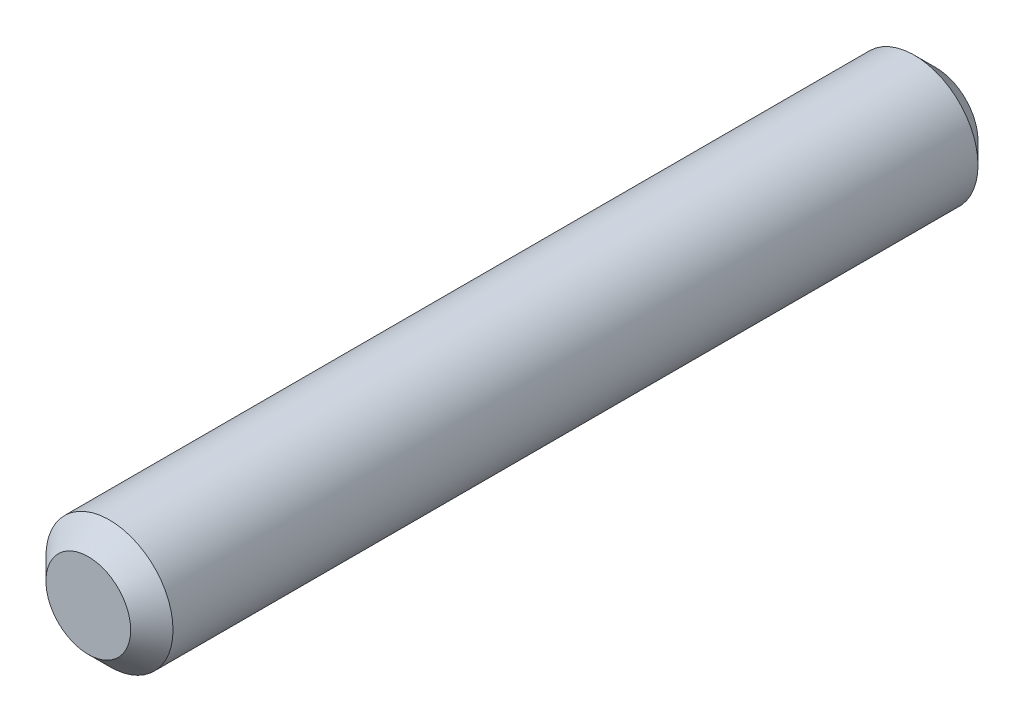
ISO-10303-21;
HEADER;
FILE_DESCRIPTION(('STEP AP214'),'2;1');
FILE_NAME('part.step','',(''),(''),'','','');
FILE_SCHEMA(('AUTOMOTIVE_DESIGN { 1 0 10303 214 1 1 1 1 }'));
ENDSEC;
DATA;
#1=APPLICATION_CONTEXT('core data for automotive mechanical design processes');
#2=APPLICATION_PROTOCOL_DEFINITION('international standard','automotive_design',2000,#1);
#3=PRODUCT_CONTEXT('',#1,'mechanical');
#4=PRODUCT('Part','Part','',(#3));
#5=PRODUCT_RELATED_PRODUCT_CATEGORY('part','',(#4));
#6=PRODUCT_DEFINITION_FORMATION('','',#4);
#7=PRODUCT_DEFINITION_CONTEXT('part definition',#1,'design');
#8=PRODUCT_DEFINITION('design','',#6,#7);
#9=PRODUCT_DEFINITION_SHAPE('','',#8);
#10=(LENGTH_UNIT() NAMED_UNIT(*) SI_UNIT(.MILLI.,.METRE.));
#11=(NAMED_UNIT(*) PLANE_ANGLE_UNIT() SI_UNIT($,.RADIAN.));
#12=(NAMED_UNIT(*) SI_UNIT($,.STERADIAN.) SOLID_ANGLE_UNIT());
#13=UNCERTAINTY_MEASURE_WITH_UNIT(LENGTH_MEASURE(1.E-05),#10,'distance_accuracy_value','');
#14=(GEOMETRIC_REPRESENTATION_CONTEXT(3) GLOBAL_UNCERTAINTY_ASSIGNED_CONTEXT((#13)) GLOBAL_UNIT_ASSIGNED_CONTEXT((#10,
#11,#12)) REPRESENTATION_CONTEXT('',''));
#15=CARTESIAN_POINT('',(0.,0.,0.));
#16=DIRECTION('',(0.,0.,1.));
#17=DIRECTION('',(1.,0.,0.));
#18=AXIS2_PLACEMENT_3D('',#15,#16,#17);
#19=CARTESIAN_POINT('',(0.,0.,20.));
#20=DIRECTION('',(0.,0.,-1.));
#21=DIRECTION('',(-1.,0.,0.));
#22=AXIS2_PLACEMENT_3D('',#19,#20,#21);
#23=CYLINDRICAL_SURFACE('',#22,1.5);
#24=CARTESIAN_POINT('',(0.,0.,0.500000000000004));
#25=DIRECTION('',(0.,0.,1.));
#26=DIRECTION('',(1.,0.,0.));
#27=AXIS2_PLACEMENT_3D('',#24,#25,#26);
#28=CIRCLE('',#27,1.5);
#29=CARTESIAN_POINT('',(1.5,0.,0.500000000000004));
#30=VERTEX_POINT('',#29);
#31=EDGE_CURVE('E45',#30,#30,#28,.T.);
#32=ORIENTED_EDGE('',*,*,#31,.T.);
#33=EDGE_LOOP('',(#32));
#34=FACE_BOUND('',#33,.T.);
#35=CARTESIAN_POINT('',(0.,0.,19.5));
#36=DIRECTION('',(0.,0.,1.));
#37=DIRECTION('',(1.,0.,0.));
#38=AXIS2_PLACEMENT_3D('',#35,#36,#37);
#39=CIRCLE('',#38,1.5);
#40=CARTESIAN_POINT('',(1.5,0.,19.5));
#41=VERTEX_POINT('',#40);
#42=EDGE_CURVE('E49',#41,#41,#39,.F.);
#43=ORIENTED_EDGE('',*,*,#42,.T.);
#44=EDGE_LOOP('',(#43));
#45=FACE_BOUND('',#44,.T.);
#46=ADVANCED_FACE('F33',(#34,#45),#23,.T.);
#47=CARTESIAN_POINT('',(0.,0.,20.));
#48=DIRECTION('',(0.,0.,1.));
#49=DIRECTION('',(1.,0.,0.));
#50=AXIS2_PLACEMENT_3D('',#47,#48,#49);
#51=PLANE('',#50);
#52=CARTESIAN_POINT('',(0.,0.,20.));
#53=DIRECTION('',(0.,0.,1.));
#54=DIRECTION('',(1.,0.,0.));
#55=AXIS2_PLACEMENT_3D('',#52,#53,#54);
#56=CIRCLE('',#55,0.999999999999999);
#57=CARTESIAN_POINT('',(0.999999999999999,0.,20.));
#58=VERTEX_POINT('',#57);
#59=EDGE_CURVE('E10',#58,#58,#56,.T.);
#60=ORIENTED_EDGE('',*,*,#59,.T.);
#61=EDGE_LOOP('',(#60));
#62=FACE_BOUND('',#61,.T.);
#63=ADVANCED_FACE('F65',(#62),#51,.T.);
#64=CARTESIAN_POINT('',(0.,0.,0.));
#65=DIRECTION('',(0.,0.,1.));
#66=DIRECTION('',(1.,0.,0.));
#67=AXIS2_PLACEMENT_3D('',#64,#65,#66);
#68=PLANE('',#67);
#69=CARTESIAN_POINT('',(0.,0.,0.));
#70=DIRECTION('',(0.,0.,1.));
#71=DIRECTION('',(1.,0.,0.));
#72=AXIS2_PLACEMENT_3D('',#69,#70,#71);
#73=CIRCLE('',#72,0.999999999999994);
#74=CARTESIAN_POINT('',(0.999999999999994,0.,0.));
#75=VERTEX_POINT('',#74);
#76=EDGE_CURVE('E41',#75,#75,#73,.F.);
#77=ORIENTED_EDGE('',*,*,#76,.T.);
#78=EDGE_LOOP('',(#77));
#79=FACE_BOUND('',#78,.T.);
#80=ADVANCED_FACE('F62',(#79),#68,.F.);
#81=CARTESIAN_POINT('',(0.,0.,0.500000000000004));
#82=DIRECTION('',(0.,0.,1.));
#83=DIRECTION('',(1.,0.,0.));
#84=AXIS2_PLACEMENT_3D('',#81,#82,#83);
#85=CONICAL_SURFACE('',#84,1.5,0.78539816339745);
#86=ORIENTED_EDGE('',*,*,#76,.F.);
#87=EDGE_LOOP('',(#86));
#88=FACE_BOUND('',#87,.T.);
#89=ORIENTED_EDGE('',*,*,#31,.F.);
#90=EDGE_LOOP('',(#89));
#91=FACE_BOUND('',#90,.T.);
#92=ADVANCED_FACE('F58',(#88,#91),#85,.T.);
#93=CARTESIAN_POINT('',(0.,0.,20.));
#94=DIRECTION('',(0.,0.,-1.));
#95=DIRECTION('',(-1.,0.,0.));
#96=AXIS2_PLACEMENT_3D('',#93,#94,#95);
#97=CONICAL_SURFACE('',#96,0.999999999999999,0.785398163397449);
#98=ORIENTED_EDGE('',*,*,#42,.F.);
#99=EDGE_LOOP('',(#98));
#100=FACE_BOUND('',#99,.T.);
#101=ORIENTED_EDGE('',*,*,#59,.F.);
#102=EDGE_LOOP('',(#101));
#103=FACE_BOUND('',#102,.T.);
#104=ADVANCED_FACE('F36',(#100,#103),#97,.T.);
#105=CLOSED_SHELL('',(#46,#63,#80,#92,#104));
#106=MANIFOLD_SOLID_BREP('B2',#105);
#107=ADVANCED_BREP_SHAPE_REPRESENTATION('',(#18,#106),#14);
#108=SHAPE_DEFINITION_REPRESENTATION(#9,#107);
ENDSEC;
END-ISO-10303-21;
